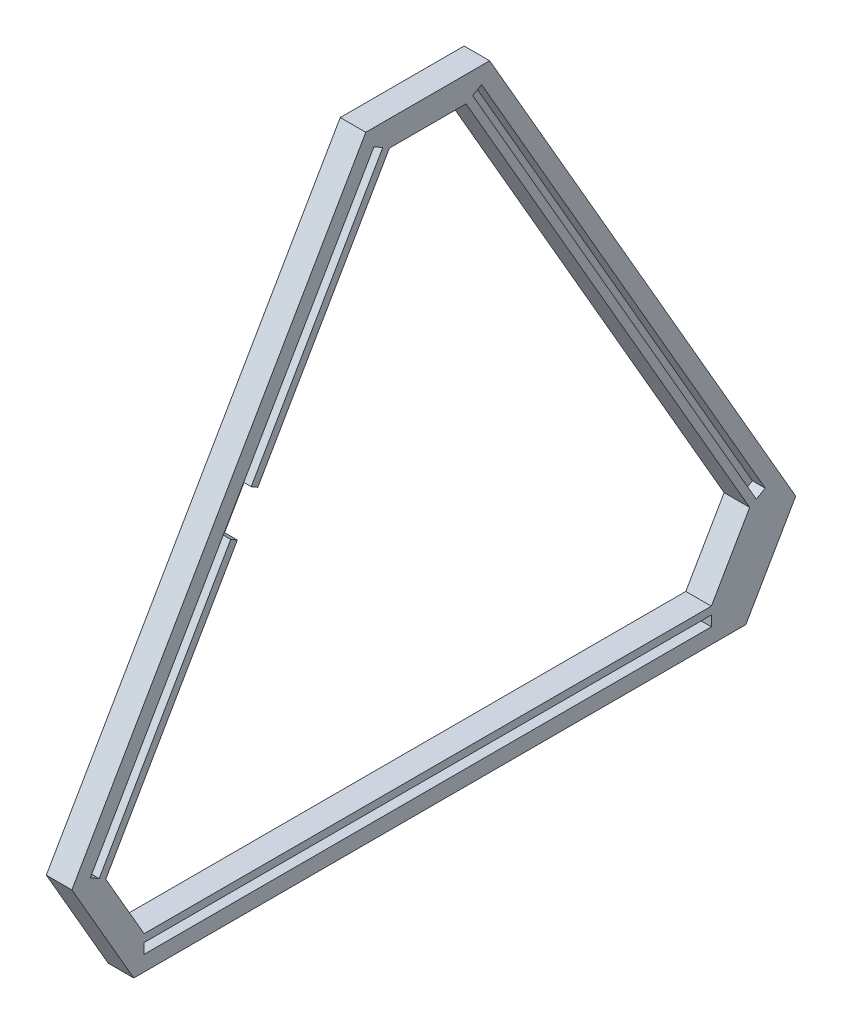
ISO-10303-21;
HEADER;
FILE_DESCRIPTION(('STEP AP214'),'2;1');
FILE_NAME('part.step','',(''),(''),'','','');
FILE_SCHEMA(('AUTOMOTIVE_DESIGN { 1 0 10303 214 1 1 1 1 }'));
ENDSEC;
DATA;
#1=APPLICATION_CONTEXT('core data for automotive mechanical design processes');
#2=APPLICATION_PROTOCOL_DEFINITION('international standard','automotive_design',2000,#1);
#3=PRODUCT_CONTEXT('',#1,'mechanical');
#4=PRODUCT('Part','Part','',(#3));
#5=PRODUCT_RELATED_PRODUCT_CATEGORY('part','',(#4));
#6=PRODUCT_DEFINITION_FORMATION('','',#4);
#7=PRODUCT_DEFINITION_CONTEXT('part definition',#1,'design');
#8=PRODUCT_DEFINITION('design','',#6,#7);
#9=PRODUCT_DEFINITION_SHAPE('','',#8);
#10=(LENGTH_UNIT() NAMED_UNIT(*) SI_UNIT(.MILLI.,.METRE.));
#11=(NAMED_UNIT(*) PLANE_ANGLE_UNIT() SI_UNIT($,.RADIAN.));
#12=(NAMED_UNIT(*) SI_UNIT($,.STERADIAN.) SOLID_ANGLE_UNIT());
#13=UNCERTAINTY_MEASURE_WITH_UNIT(LENGTH_MEASURE(1.E-05),#10,'distance_accuracy_value','');
#14=(GEOMETRIC_REPRESENTATION_CONTEXT(3) GLOBAL_UNCERTAINTY_ASSIGNED_CONTEXT((#13)) GLOBAL_UNIT_ASSIGNED_CONTEXT((#10,
#11,#12)) REPRESENTATION_CONTEXT('',''));
#15=CARTESIAN_POINT('',(0.,0.,0.));
#16=DIRECTION('',(0.,0.,1.));
#17=DIRECTION('',(1.,0.,0.));
#18=AXIS2_PLACEMENT_3D('',#15,#16,#17);
#19=CARTESIAN_POINT('',(157.5,13.7403810567666,-6.20096189432337));
#20=DIRECTION('',(0.,-0.5,-0.866025403784439));
#21=DIRECTION('',(0.,0.866025403784439,-0.5));
#22=AXIS2_PLACEMENT_3D('',#19,#20,#21);
#23=PLANE('',#22);
#24=DIRECTION('',(0.,0.866025403784439,-0.5));
#25=VECTOR('',#24,1.);
#26=CARTESIAN_POINT('',(157.5,13.7403810567666,-6.20096189432337));
#27=LINE('',#26,#25);
#28=CARTESIAN_POINT('',(157.5,65.2688925819407,-35.9509618943233));
#29=VERTEX_POINT('',#28);
#30=CARTESIAN_POINT('',(157.5,109.869200876839,-61.7009618943233));
#31=VERTEX_POINT('',#30);
#32=EDGE_CURVE('E244',#29,#31,#27,.T.);
#33=ORIENTED_EDGE('',*,*,#32,.F.);
#34=DIRECTION('',(1.,0.,0.));
#35=VECTOR('',#34,1.);
#36=CARTESIAN_POINT('',(157.5,65.2688925819407,-35.9509618943234));
#37=LINE('',#36,#35);
#38=CARTESIAN_POINT('',(160.,65.2688925819407,-35.9509618943234));
#39=VERTEX_POINT('',#38);
#40=EDGE_CURVE('E237',#29,#39,#37,.T.);
#41=ORIENTED_EDGE('',*,*,#40,.T.);
#42=DIRECTION('',(0.,0.866025403784439,-0.5));
#43=VECTOR('',#42,1.);
#44=CARTESIAN_POINT('',(160.,13.7403810567666,-6.20096189432337));
#45=LINE('',#44,#43);
#46=CARTESIAN_POINT('',(160.,109.869200876839,-61.7009618943233));
#47=VERTEX_POINT('',#46);
#48=EDGE_CURVE('E256',#39,#47,#45,.T.);
#49=ORIENTED_EDGE('',*,*,#48,.T.);
#50=DIRECTION('',(1.,0.,0.));
#51=VECTOR('',#50,1.);
#52=CARTESIAN_POINT('',(157.5,109.869200876839,-61.7009618943233));
#53=LINE('',#52,#51);
#54=EDGE_CURVE('E270',#31,#47,#53,.T.);
#55=ORIENTED_EDGE('',*,*,#54,.F.);
#56=EDGE_LOOP('',(#33,#41,#49,#55));
#57=FACE_BOUND('',#56,.T.);
#58=ADVANCED_FACE('F33',(#57),#23,.F.);
#59=CARTESIAN_POINT('',(160.,10.3947095812217,-142.504165124599));
#60=DIRECTION('',(0.,-0.5,0.866025403784438));
#61=DIRECTION('',(0.,-0.866025403784438,-0.5));
#62=AXIS2_PLACEMENT_3D('',#59,#60,#61);
#63=PLANE('',#62);
#64=DIRECTION('',(0.,0.866025403784438,0.5));
#65=VECTOR('',#64,1.);
#66=CARTESIAN_POINT('',(155.,10.3947095812217,-142.504165124599));
#67=LINE('',#66,#65);
#68=CARTESIAN_POINT('',(155.,10.3947095812217,-142.504165124599));
#69=VERTEX_POINT('',#68);
#70=CARTESIAN_POINT('',(155.,114.119200876839,-82.618802153517));
#71=VERTEX_POINT('',#70);
#72=EDGE_CURVE('E312',#69,#71,#67,.T.);
#73=ORIENTED_EDGE('',*,*,#72,.T.);
#74=DIRECTION('',(-1.,0.,0.));
#75=VECTOR('',#74,1.);
#76=CARTESIAN_POINT('',(160.,114.119200876839,-82.618802153517));
#77=LINE('',#76,#75);
#78=CARTESIAN_POINT('',(160.,114.119200876839,-82.618802153517));
#79=VERTEX_POINT('',#78);
#80=EDGE_CURVE('E11',#79,#71,#77,.T.);
#81=ORIENTED_EDGE('',*,*,#80,.F.);
#82=DIRECTION('',(0.,0.866025403784438,0.5));
#83=VECTOR('',#82,1.);
#84=CARTESIAN_POINT('',(160.,10.3947095812217,-142.504165124599));
#85=LINE('',#84,#83);
#86=CARTESIAN_POINT('',(160.,10.3947095812217,-142.504165124599));
#87=VERTEX_POINT('',#86);
#88=EDGE_CURVE('E324',#87,#79,#85,.T.);
#89=ORIENTED_EDGE('',*,*,#88,.F.);
#90=DIRECTION('',(-1.,0.,0.));
#91=VECTOR('',#90,1.);
#92=CARTESIAN_POINT('',(160.,10.3947095812217,-142.504165124599));
#93=LINE('',#92,#91);
#94=EDGE_CURVE('E338',#87,#69,#93,.T.);
#95=ORIENTED_EDGE('',*,*,#94,.T.);
#96=EDGE_LOOP('',(#73,#81,#89,#95));
#97=FACE_BOUND('',#96,.T.);
#98=ADVANCED_FACE('F35',(#97),#63,.F.);
#99=CARTESIAN_POINT('',(160.,114.119200876839,-82.618802153517));
#100=DIRECTION('',(0.,-1.,0.));
#101=DIRECTION('',(0.,0.,-1.));
#102=AXIS2_PLACEMENT_3D('',#99,#100,#101);
#103=PLANE('',#102);
#104=DIRECTION('',(0.,0.,1.));
#105=VECTOR('',#104,1.);
#106=CARTESIAN_POINT('',(155.,114.119200876839,-82.618802153517));
#107=LINE('',#106,#105);
#108=CARTESIAN_POINT('',(155.,114.119200876839,-58.381197846483));
#109=VERTEX_POINT('',#108);
#110=EDGE_CURVE('E341',#71,#109,#107,.T.);
#111=ORIENTED_EDGE('',*,*,#110,.T.);
#112=DIRECTION('',(-1.,0.,0.));
#113=VECTOR('',#112,1.);
#114=CARTESIAN_POINT('',(160.,114.119200876839,-58.381197846483));
#115=LINE('',#114,#113);
#116=CARTESIAN_POINT('',(160.,114.119200876839,-58.381197846483));
#117=VERTEX_POINT('',#116);
#118=EDGE_CURVE('E41',#117,#109,#115,.T.);
#119=ORIENTED_EDGE('',*,*,#118,.F.);
#120=DIRECTION('',(0.,0.,1.));
#121=VECTOR('',#120,1.);
#122=CARTESIAN_POINT('',(160.,114.119200876839,-82.618802153517));
#123=LINE('',#122,#121);
#124=EDGE_CURVE('E327',#79,#117,#123,.T.);
#125=ORIENTED_EDGE('',*,*,#124,.F.);
#126=ORIENTED_EDGE('',*,*,#80,.T.);
#127=EDGE_LOOP('',(#111,#119,#125,#126));
#128=FACE_BOUND('',#127,.T.);
#129=ADVANCED_FACE('F388',(#128),#103,.F.);
#130=CARTESIAN_POINT('',(160.,114.119200876839,-58.381197846483));
#131=DIRECTION('',(0.,-0.5,-0.866025403784439));
#132=DIRECTION('',(0.,0.866025403784439,-0.5));
#133=AXIS2_PLACEMENT_3D('',#130,#131,#132);
#134=PLANE('',#133);
#135=DIRECTION('',(0.,-0.866025403784439,0.5));
#136=VECTOR('',#135,1.);
#137=CARTESIAN_POINT('',(155.,114.119200876839,-58.381197846483));
#138=LINE('',#137,#136);
#139=CARTESIAN_POINT('',(155.,14.4903810567665,-0.86047190431933));
#140=VERTEX_POINT('',#139);
#141=EDGE_CURVE('E343',#109,#140,#138,.T.);
#142=ORIENTED_EDGE('',*,*,#141,.T.);
#143=DIRECTION('',(-1.,0.,0.));
#144=VECTOR('',#143,1.);
#145=CARTESIAN_POINT('',(160.,14.4903810567665,-0.86047190431933));
#146=LINE('',#145,#144);
#147=CARTESIAN_POINT('',(160.,14.4903810567665,-0.86047190431933));
#148=VERTEX_POINT('',#147);
#149=EDGE_CURVE('E358',#148,#140,#146,.T.);
#150=ORIENTED_EDGE('',*,*,#149,.F.);
#151=DIRECTION('',(0.,-0.866025403784439,0.5));
#152=VECTOR('',#151,1.);
#153=CARTESIAN_POINT('',(160.,114.119200876839,-58.381197846483));
#154=LINE('',#153,#152);
#155=EDGE_CURVE('E330',#117,#148,#154,.T.);
#156=ORIENTED_EDGE('',*,*,#155,.F.);
#157=ORIENTED_EDGE('',*,*,#118,.T.);
#158=EDGE_LOOP('',(#142,#150,#156,#157));
#159=FACE_BOUND('',#158,.T.);
#160=ADVANCED_FACE('F365',(#159),#134,.F.);
#161=CARTESIAN_POINT('',(160.,14.4903810567665,-0.86047190431933));
#162=DIRECTION('',(0.,0.5,-0.866025403784439));
#163=DIRECTION('',(0.,0.866025403784439,0.5));
#164=AXIS2_PLACEMENT_3D('',#161,#162,#163);
#165=PLANE('',#164);
#166=DIRECTION('',(0.,-0.866025403784438,-0.5));
#167=VECTOR('',#166,1.);
#168=CARTESIAN_POINT('',(155.,14.4903810567665,-0.86047190431933));
#169=LINE('',#168,#167);
#170=CARTESIAN_POINT('',(155.,-6.5,-12.9792740578363));
#171=VERTEX_POINT('',#170);
#172=EDGE_CURVE('E345',#140,#171,#169,.T.);
#173=ORIENTED_EDGE('',*,*,#172,.T.);
#174=DIRECTION('',(-1.,0.,0.));
#175=VECTOR('',#174,1.);
#176=CARTESIAN_POINT('',(160.,-6.5,-12.9792740578363));
#177=LINE('',#176,#175);
#178=CARTESIAN_POINT('',(160.,-6.5,-12.9792740578363));
#179=VERTEX_POINT('',#178);
#180=EDGE_CURVE('E355',#179,#171,#177,.T.);
#181=ORIENTED_EDGE('',*,*,#180,.F.);
#182=DIRECTION('',(0.,-0.866025403784438,-0.5));
#183=VECTOR('',#182,1.);
#184=CARTESIAN_POINT('',(160.,14.4903810567665,-0.86047190431933));
#185=LINE('',#184,#183);
#186=EDGE_CURVE('E332',#148,#179,#185,.T.);
#187=ORIENTED_EDGE('',*,*,#186,.F.);
#188=ORIENTED_EDGE('',*,*,#149,.T.);
#189=EDGE_LOOP('',(#173,#181,#187,#188));
#190=FACE_BOUND('',#189,.T.);
#191=ADVANCED_FACE('F376',(#190),#165,.F.);
#192=CARTESIAN_POINT('',(160.,-6.5,-12.9792740578363));
#193=DIRECTION('',(0.,1.,0.));
#194=DIRECTION('',(0.,0.,1.));
#195=AXIS2_PLACEMENT_3D('',#192,#193,#194);
#196=PLANE('',#195);
#197=DIRECTION('',(0.,0.,-1.));
#198=VECTOR('',#197,1.);
#199=CARTESIAN_POINT('',(155.,-6.5,-12.9792740578363));
#200=LINE('',#199,#198);
#201=CARTESIAN_POINT('',(155.,-6.5,-132.75));
#202=VERTEX_POINT('',#201);
#203=EDGE_CURVE('E347',#171,#202,#200,.T.);
#204=ORIENTED_EDGE('',*,*,#203,.T.);
#205=DIRECTION('',(-1.,0.,0.));
#206=VECTOR('',#205,1.);
#207=CARTESIAN_POINT('',(160.,-6.5,-132.75));
#208=LINE('',#207,#206);
#209=CARTESIAN_POINT('',(160.,-6.5,-132.75));
#210=VERTEX_POINT('',#209);
#211=EDGE_CURVE('E352',#210,#202,#208,.T.);
#212=ORIENTED_EDGE('',*,*,#211,.F.);
#213=DIRECTION('',(0.,0.,-1.));
#214=VECTOR('',#213,1.);
#215=CARTESIAN_POINT('',(160.,-6.5,-12.9792740578363));
#216=LINE('',#215,#214);
#217=EDGE_CURVE('E334',#179,#210,#216,.T.);
#218=ORIENTED_EDGE('',*,*,#217,.F.);
#219=ORIENTED_EDGE('',*,*,#180,.T.);
#220=EDGE_LOOP('',(#204,#212,#218,#219));
#221=FACE_BOUND('',#220,.T.);
#222=ADVANCED_FACE('F380',(#221),#196,.F.);
#223=CARTESIAN_POINT('',(160.,-6.5,-132.75));
#224=DIRECTION('',(0.,0.5,0.866025403784439));
#225=DIRECTION('',(0.,-0.866025403784439,0.5));
#226=AXIS2_PLACEMENT_3D('',#223,#224,#225);
#227=PLANE('',#226);
#228=DIRECTION('',(0.,0.866025403784439,-0.5));
#229=VECTOR('',#228,1.);
#230=CARTESIAN_POINT('',(155.,-6.5,-132.75));
#231=LINE('',#230,#229);
#232=EDGE_CURVE('E328',#202,#69,#231,.T.);
#233=ORIENTED_EDGE('',*,*,#232,.T.);
#234=ORIENTED_EDGE('',*,*,#94,.F.);
#235=DIRECTION('',(0.,0.866025403784439,-0.5));
#236=VECTOR('',#235,1.);
#237=CARTESIAN_POINT('',(160.,-6.5,-132.75));
#238=LINE('',#237,#236);
#239=EDGE_CURVE('E336',#210,#87,#238,.T.);
#240=ORIENTED_EDGE('',*,*,#239,.F.);
#241=ORIENTED_EDGE('',*,*,#211,.T.);
#242=EDGE_LOOP('',(#233,#234,#240,#241));
#243=FACE_BOUND('',#242,.T.);
#244=ADVANCED_FACE('F391',(#243),#227,.F.);
#245=CARTESIAN_POINT('',(160.,114.119200876839,-82.618802153517));
#246=DIRECTION('',(1.,0.,0.));
#247=DIRECTION('',(0.,0.,-1.));
#248=AXIS2_PLACEMENT_3D('',#245,#246,#247);
#249=PLANE('',#248);
#250=DIRECTION('',(0.,0.499999999999999,0.866025403784439));
#251=VECTOR('',#250,1.);
#252=CARTESIAN_POINT('',(160.,64.5188925819407,-37.25));
#253=LINE('',#252,#251);
#254=CARTESIAN_POINT('',(160.,64.5188925819407,-37.25));
#255=VERTEX_POINT('',#254);
#256=EDGE_CURVE('E648',#255,#39,#253,.T.);
#257=ORIENTED_EDGE('',*,*,#256,.F.);
#258=DIRECTION('',(0.,-0.866025403784439,0.5));
#259=VECTOR('',#258,1.);
#260=CARTESIAN_POINT('',(160.,109.119200876839,-63.));
#261=LINE('',#260,#259);
#262=CARTESIAN_POINT('',(160.,109.119200876839,-63.));
#263=VERTEX_POINT('',#262);
#264=EDGE_CURVE('E299',#263,#255,#261,.T.);
#265=ORIENTED_EDGE('',*,*,#264,.F.);
#266=DIRECTION('',(0.,0.,1.));
#267=VECTOR('',#266,1.);
#268=CARTESIAN_POINT('',(160.,109.119200876839,-78.));
#269=LINE('',#268,#267);
#270=CARTESIAN_POINT('',(160.,109.119200876839,-78.));
#271=VERTEX_POINT('',#270);
#272=EDGE_CURVE('E295',#271,#263,#269,.T.);
#273=ORIENTED_EDGE('',*,*,#272,.F.);
#274=DIRECTION('',(0.,0.866025403784439,0.5));
#275=VECTOR('',#274,1.);
#276=CARTESIAN_POINT('',(160.,12.9903810567666,-133.5));
#277=LINE('',#276,#275);
#278=CARTESIAN_POINT('',(160.,12.9903810567666,-133.5));
#279=VERTEX_POINT('',#278);
#280=EDGE_CURVE('E267',#279,#271,#277,.T.);
#281=ORIENTED_EDGE('',*,*,#280,.F.);
#282=DIRECTION('',(0.,0.866025403784438,-0.500000000000001));
#283=VECTOR('',#282,1.);
#284=CARTESIAN_POINT('',(160.,0.,-126.));
#285=LINE('',#284,#283);
#286=CARTESIAN_POINT('',(160.,0.,-126.));
#287=VERTEX_POINT('',#286);
#288=EDGE_CURVE('E278',#287,#279,#285,.T.);
#289=ORIENTED_EDGE('',*,*,#288,.F.);
#290=DIRECTION('',(0.,0.,-1.));
#291=VECTOR('',#290,1.);
#292=CARTESIAN_POINT('',(160.,0.,-15.));
#293=LINE('',#292,#291);
#294=CARTESIAN_POINT('',(160.,0.,-15.));
#295=VERTEX_POINT('',#294);
#296=EDGE_CURVE('E305',#295,#287,#293,.T.);
#297=ORIENTED_EDGE('',*,*,#296,.F.);
#298=DIRECTION('',(0.,-0.866025403784439,-0.5));
#299=VECTOR('',#298,1.);
#300=CARTESIAN_POINT('',(160.,12.9903810567666,-7.49999999999999));
#301=LINE('',#300,#299);
#302=CARTESIAN_POINT('',(160.,12.9903810567666,-7.49999999999999));
#303=VERTEX_POINT('',#302);
#304=EDGE_CURVE('E302',#303,#295,#301,.T.);
#305=ORIENTED_EDGE('',*,*,#304,.F.);
#306=CARTESIAN_POINT('',(160.,57.5906893516652,-33.25));
#307=VERTEX_POINT('',#306);
#308=EDGE_CURVE('E298',#307,#303,#261,.T.);
#309=ORIENTED_EDGE('',*,*,#308,.F.);
#310=DIRECTION('',(0.,-0.499999999999999,-0.866025403784439));
#311=VECTOR('',#310,1.);
#312=CARTESIAN_POINT('',(160.,57.5906893516652,-33.25));
#313=LINE('',#312,#311);
#314=CARTESIAN_POINT('',(160.,58.3406893516651,-31.9509618943234));
#315=VERTEX_POINT('',#314);
#316=EDGE_CURVE('E646',#315,#307,#313,.T.);
#317=ORIENTED_EDGE('',*,*,#316,.F.);
#318=CARTESIAN_POINT('',(160.,13.7403810567666,-6.20096189432338));
#319=VERTEX_POINT('',#318);
#320=EDGE_CURVE('E236',#319,#315,#45,.T.);
#321=ORIENTED_EDGE('',*,*,#320,.F.);
#322=DIRECTION('',(0.,-0.499999999999999,-0.866025403784439));
#323=VECTOR('',#322,1.);
#324=CARTESIAN_POINT('',(160.,14.7403810567665,-4.46891108675453));
#325=LINE('',#324,#323);
#326=CARTESIAN_POINT('',(160.,14.7403810567665,-4.46891108675453));
#327=VERTEX_POINT('',#326);
#328=EDGE_CURVE('E254',#327,#319,#325,.T.);
#329=ORIENTED_EDGE('',*,*,#328,.F.);
#330=DIRECTION('',(0.,-0.866025403784439,0.499999999999999));
#331=VECTOR('',#330,1.);
#332=CARTESIAN_POINT('',(160.,110.869200876839,-59.9689110867545));
#333=LINE('',#332,#331);
#334=CARTESIAN_POINT('',(160.,110.869200876839,-59.9689110867545));
#335=VERTEX_POINT('',#334);
#336=EDGE_CURVE('E262',#335,#327,#333,.T.);
#337=ORIENTED_EDGE('',*,*,#336,.F.);
#338=DIRECTION('',(0.,0.499999999999998,0.866025403784439));
#339=VECTOR('',#338,1.);
#340=CARTESIAN_POINT('',(160.,109.869200876839,-61.7009618943233));
#341=LINE('',#340,#339);
#342=EDGE_CURVE('E259',#47,#335,#341,.T.);
#343=ORIENTED_EDGE('',*,*,#342,.F.);
#344=ORIENTED_EDGE('',*,*,#48,.F.);
#345=EDGE_LOOP('',(#257,#265,#273,#281,#289,#297,#305,#309,#317,#321,#329,#337,#343,#344));
#346=FACE_BOUND('',#345,.T.);
#347=DIRECTION('',(0.,-0.500000000000011,0.866025403784432));
#348=VECTOR('',#347,1.);
#349=CARTESIAN_POINT('',(160.,110.869200876839,-81.0310889132455));
#350=LINE('',#349,#348);
#351=CARTESIAN_POINT('',(160.,110.869200876839,-81.0310889132455));
#352=VERTEX_POINT('',#351);
#353=CARTESIAN_POINT('',(160.,109.869200876839,-79.2990381056767));
#354=VERTEX_POINT('',#353);
#355=EDGE_CURVE('E56',#352,#354,#350,.T.);
#356=ORIENTED_EDGE('',*,*,#355,.F.);
#357=DIRECTION('',(0.,0.866025403784439,0.5));
#358=VECTOR('',#357,1.);
#359=CARTESIAN_POINT('',(160.,14.7403810567665,-136.531088913245));
#360=LINE('',#359,#358);
#361=CARTESIAN_POINT('',(160.,14.7403810567665,-136.531088913245));
#362=VERTEX_POINT('',#361);
#363=EDGE_CURVE('E663',#362,#352,#360,.T.);
#364=ORIENTED_EDGE('',*,*,#363,.F.);
#365=DIRECTION('',(0.,0.499999999999997,-0.86602540378444));
#366=VECTOR('',#365,1.);
#367=CARTESIAN_POINT('',(160.,13.7403810567666,-134.799038105677));
#368=LINE('',#367,#366);
#369=CARTESIAN_POINT('',(160.,13.7403810567666,-134.799038105677));
#370=VERTEX_POINT('',#369);
#371=EDGE_CURVE('E677',#370,#362,#368,.T.);
#372=ORIENTED_EDGE('',*,*,#371,.F.);
#373=DIRECTION('',(0.,-0.866025403784439,-0.499999999999999));
#374=VECTOR('',#373,1.);
#375=CARTESIAN_POINT('',(160.,109.869200876839,-79.2990381056767));
#376=LINE('',#375,#374);
#377=EDGE_CURVE('E674',#354,#370,#376,.T.);
#378=ORIENTED_EDGE('',*,*,#377,.F.);
#379=EDGE_LOOP('',(#356,#364,#372,#378));
#380=FACE_BOUND('',#379,.T.);
#381=DIRECTION('',(0.,-1.,0.));
#382=VECTOR('',#381,1.);
#383=CARTESIAN_POINT('',(160.,-1.5,-15.));
#384=LINE('',#383,#382);
#385=CARTESIAN_POINT('',(160.,-1.5,-15.));
#386=VERTEX_POINT('',#385);
#387=CARTESIAN_POINT('',(160.,-3.49999999999995,-15.));
#388=VERTEX_POINT('',#387);
#389=EDGE_CURVE('E684',#386,#388,#384,.T.);
#390=ORIENTED_EDGE('',*,*,#389,.F.);
#391=DIRECTION('',(0.,0.,1.));
#392=VECTOR('',#391,1.);
#393=CARTESIAN_POINT('',(160.,-1.5,-15.));
#394=LINE('',#393,#392);
#395=CARTESIAN_POINT('',(160.,-1.5,-126.));
#396=VERTEX_POINT('',#395);
#397=EDGE_CURVE('E694',#396,#386,#394,.T.);
#398=ORIENTED_EDGE('',*,*,#397,.F.);
#399=DIRECTION('',(0.,1.,0.));
#400=VECTOR('',#399,1.);
#401=CARTESIAN_POINT('',(160.,-1.5,-126.));
#402=LINE('',#401,#400);
#403=CARTESIAN_POINT('',(160.,-3.49999999999995,-126.));
#404=VERTEX_POINT('',#403);
#405=EDGE_CURVE('E708',#404,#396,#402,.T.);
#406=ORIENTED_EDGE('',*,*,#405,.F.);
#407=DIRECTION('',(0.,0.,-1.));
#408=VECTOR('',#407,1.);
#409=CARTESIAN_POINT('',(160.,-3.49999999999995,-15.));
#410=LINE('',#409,#408);
#411=EDGE_CURVE('E705',#388,#404,#410,.T.);
#412=ORIENTED_EDGE('',*,*,#411,.F.);
#413=EDGE_LOOP('',(#390,#398,#406,#412));
#414=FACE_BOUND('',#413,.T.);
#415=ORIENTED_EDGE('',*,*,#88,.T.);
#416=ORIENTED_EDGE('',*,*,#124,.T.);
#417=ORIENTED_EDGE('',*,*,#155,.T.);
#418=ORIENTED_EDGE('',*,*,#186,.T.);
#419=ORIENTED_EDGE('',*,*,#217,.T.);
#420=ORIENTED_EDGE('',*,*,#239,.T.);
#421=EDGE_LOOP('',(#415,#416,#417,#418,#419,#420));
#422=FACE_BOUND('',#421,.T.);
#423=ADVANCED_FACE('F384',(#346,#380,#414,#422),#249,.T.);
#424=CARTESIAN_POINT('',(155.,114.119200876839,-82.618802153517));
#425=DIRECTION('',(1.,0.,0.));
#426=DIRECTION('',(0.,0.,-1.));
#427=AXIS2_PLACEMENT_3D('',#424,#425,#426);
#428=PLANE('',#427);
#429=DIRECTION('',(0.,0.866025403784438,-0.500000000000001));
#430=VECTOR('',#429,1.);
#431=CARTESIAN_POINT('',(155.,0.,-126.));
#432=LINE('',#431,#430);
#433=CARTESIAN_POINT('',(155.,0.,-126.));
#434=VERTEX_POINT('',#433);
#435=CARTESIAN_POINT('',(155.,12.9903810567666,-133.5));
#436=VERTEX_POINT('',#435);
#437=EDGE_CURVE('E290',#434,#436,#432,.T.);
#438=ORIENTED_EDGE('',*,*,#437,.T.);
#439=DIRECTION('',(0.,0.866025403784439,0.5));
#440=VECTOR('',#439,1.);
#441=CARTESIAN_POINT('',(155.,12.9903810567666,-133.5));
#442=LINE('',#441,#440);
#443=CARTESIAN_POINT('',(155.,109.119200876839,-78.));
#444=VERTEX_POINT('',#443);
#445=EDGE_CURVE('E274',#436,#444,#442,.T.);
#446=ORIENTED_EDGE('',*,*,#445,.T.);
#447=DIRECTION('',(0.,0.,1.));
#448=VECTOR('',#447,1.);
#449=CARTESIAN_POINT('',(155.,109.119200876839,-78.));
#450=LINE('',#449,#448);
#451=CARTESIAN_POINT('',(155.,109.119200876839,-63.));
#452=VERTEX_POINT('',#451);
#453=EDGE_CURVE('E277',#444,#452,#450,.T.);
#454=ORIENTED_EDGE('',*,*,#453,.T.);
#455=DIRECTION('',(0.,-0.866025403784439,0.5));
#456=VECTOR('',#455,1.);
#457=CARTESIAN_POINT('',(155.,109.119200876839,-63.));
#458=LINE('',#457,#456);
#459=CARTESIAN_POINT('',(155.,12.9903810567666,-7.49999999999999));
#460=VERTEX_POINT('',#459);
#461=EDGE_CURVE('E281',#452,#460,#458,.T.);
#462=ORIENTED_EDGE('',*,*,#461,.T.);
#463=DIRECTION('',(0.,-0.866025403784439,-0.5));
#464=VECTOR('',#463,1.);
#465=CARTESIAN_POINT('',(155.,12.9903810567666,-7.49999999999999));
#466=LINE('',#465,#464);
#467=CARTESIAN_POINT('',(155.,0.,-15.));
#468=VERTEX_POINT('',#467);
#469=EDGE_CURVE('E284',#460,#468,#466,.T.);
#470=ORIENTED_EDGE('',*,*,#469,.T.);
#471=DIRECTION('',(0.,0.,-1.));
#472=VECTOR('',#471,1.);
#473=CARTESIAN_POINT('',(155.,0.,-15.));
#474=LINE('',#473,#472);
#475=EDGE_CURVE('E287',#468,#434,#474,.T.);
#476=ORIENTED_EDGE('',*,*,#475,.T.);
#477=EDGE_LOOP('',(#438,#446,#454,#462,#470,#476));
#478=FACE_BOUND('',#477,.T.);
#479=ORIENTED_EDGE('',*,*,#72,.F.);
#480=ORIENTED_EDGE('',*,*,#232,.F.);
#481=ORIENTED_EDGE('',*,*,#203,.F.);
#482=ORIENTED_EDGE('',*,*,#172,.F.);
#483=ORIENTED_EDGE('',*,*,#141,.F.);
#484=ORIENTED_EDGE('',*,*,#110,.F.);
#485=EDGE_LOOP('',(#479,#480,#481,#482,#483,#484));
#486=FACE_BOUND('',#485,.T.);
#487=ADVANCED_FACE('F371',(#478,#486),#428,.F.);
#488=CARTESIAN_POINT('',(155.,12.9903810567666,-133.5));
#489=DIRECTION('',(0.,0.5,-0.866025403784439));
#490=DIRECTION('',(0.,0.866025403784439,0.5));
#491=AXIS2_PLACEMENT_3D('',#488,#489,#490);
#492=PLANE('',#491);
#493=ORIENTED_EDGE('',*,*,#280,.T.);
#494=DIRECTION('',(1.,0.,0.));
#495=VECTOR('',#494,1.);
#496=CARTESIAN_POINT('',(155.,109.119200876839,-78.));
#497=LINE('',#496,#495);
#498=EDGE_CURVE('E293',#444,#271,#497,.T.);
#499=ORIENTED_EDGE('',*,*,#498,.F.);
#500=ORIENTED_EDGE('',*,*,#445,.F.);
#501=DIRECTION('',(1.,0.,0.));
#502=VECTOR('',#501,1.);
#503=CARTESIAN_POINT('',(155.,12.9903810567666,-133.5));
#504=LINE('',#503,#502);
#505=EDGE_CURVE('E310',#436,#279,#504,.T.);
#506=ORIENTED_EDGE('',*,*,#505,.T.);
#507=EDGE_LOOP('',(#493,#499,#500,#506));
#508=FACE_BOUND('',#507,.T.);
#509=ADVANCED_FACE('F585',(#508),#492,.F.);
#510=CARTESIAN_POINT('',(155.,0.,-126.));
#511=DIRECTION('',(0.,-0.500000000000001,-0.866025403784438));
#512=DIRECTION('',(0.,0.866025403784438,-0.500000000000001));
#513=AXIS2_PLACEMENT_3D('',#510,#511,#512);
#514=PLANE('',#513);
#515=ORIENTED_EDGE('',*,*,#288,.T.);
#516=ORIENTED_EDGE('',*,*,#505,.F.);
#517=ORIENTED_EDGE('',*,*,#437,.F.);
#518=DIRECTION('',(1.,0.,0.));
#519=VECTOR('',#518,1.);
#520=CARTESIAN_POINT('',(155.,0.,-126.));
#521=LINE('',#520,#519);
#522=EDGE_CURVE('E313',#434,#287,#521,.T.);
#523=ORIENTED_EDGE('',*,*,#522,.T.);
#524=EDGE_LOOP('',(#515,#516,#517,#523));
#525=FACE_BOUND('',#524,.T.);
#526=ADVANCED_FACE('F591',(#525),#514,.F.);
#527=CARTESIAN_POINT('',(155.,0.,-15.));
#528=DIRECTION('',(0.,-1.,0.));
#529=DIRECTION('',(0.,0.,-1.));
#530=AXIS2_PLACEMENT_3D('',#527,#528,#529);
#531=PLANE('',#530);
#532=ORIENTED_EDGE('',*,*,#296,.T.);
#533=ORIENTED_EDGE('',*,*,#522,.F.);
#534=ORIENTED_EDGE('',*,*,#475,.F.);
#535=DIRECTION('',(1.,0.,0.));
#536=VECTOR('',#535,1.);
#537=CARTESIAN_POINT('',(155.,0.,-15.));
#538=LINE('',#537,#536);
#539=EDGE_CURVE('E315',#468,#295,#538,.T.);
#540=ORIENTED_EDGE('',*,*,#539,.T.);
#541=EDGE_LOOP('',(#532,#533,#534,#540));
#542=FACE_BOUND('',#541,.T.);
#543=ADVANCED_FACE('F599',(#542),#531,.F.);
#544=CARTESIAN_POINT('',(155.,12.9903810567666,-7.49999999999999));
#545=DIRECTION('',(0.,-0.5,0.866025403784439));
#546=DIRECTION('',(0.,-0.866025403784439,-0.5));
#547=AXIS2_PLACEMENT_3D('',#544,#545,#546);
#548=PLANE('',#547);
#549=ORIENTED_EDGE('',*,*,#304,.T.);
#550=ORIENTED_EDGE('',*,*,#539,.F.);
#551=ORIENTED_EDGE('',*,*,#469,.F.);
#552=DIRECTION('',(1.,0.,0.));
#553=VECTOR('',#552,1.);
#554=CARTESIAN_POINT('',(155.,12.9903810567666,-7.49999999999999));
#555=LINE('',#554,#553);
#556=EDGE_CURVE('E317',#460,#303,#555,.T.);
#557=ORIENTED_EDGE('',*,*,#556,.T.);
#558=EDGE_LOOP('',(#549,#550,#551,#557));
#559=FACE_BOUND('',#558,.T.);
#560=ADVANCED_FACE('F539',(#559),#548,.F.);
#561=CARTESIAN_POINT('',(155.,109.119200876839,-63.));
#562=DIRECTION('',(0.,0.5,0.866025403784439));
#563=DIRECTION('',(0.,-0.866025403784439,0.5));
#564=AXIS2_PLACEMENT_3D('',#561,#562,#563);
#565=PLANE('',#564);
#566=ORIENTED_EDGE('',*,*,#264,.T.);
#567=DIRECTION('',(1.,0.,0.));
#568=VECTOR('',#567,1.);
#569=CARTESIAN_POINT('',(157.5,64.5188925819407,-37.25));
#570=LINE('',#569,#568);
#571=CARTESIAN_POINT('',(157.5,64.5188925819407,-37.25));
#572=VERTEX_POINT('',#571);
#573=EDGE_CURVE('E654',#572,#255,#570,.T.);
#574=ORIENTED_EDGE('',*,*,#573,.F.);
#575=DIRECTION('',(0.,0.866025403784439,-0.499999999999999));
#576=VECTOR('',#575,1.);
#577=CARTESIAN_POINT('',(157.5,64.5188925819407,-37.25));
#578=LINE('',#577,#576);
#579=CARTESIAN_POINT('',(157.5,57.5906893516652,-33.25));
#580=VERTEX_POINT('',#579);
#581=EDGE_CURVE('E226',#580,#572,#578,.T.);
#582=ORIENTED_EDGE('',*,*,#581,.F.);
#583=DIRECTION('',(1.,0.,0.));
#584=VECTOR('',#583,1.);
#585=CARTESIAN_POINT('',(157.5,57.5906893516652,-33.25));
#586=LINE('',#585,#584);
#587=EDGE_CURVE('E223',#580,#307,#586,.T.);
#588=ORIENTED_EDGE('',*,*,#587,.T.);
#589=ORIENTED_EDGE('',*,*,#308,.T.);
#590=ORIENTED_EDGE('',*,*,#556,.F.);
#591=ORIENTED_EDGE('',*,*,#461,.F.);
#592=DIRECTION('',(1.,0.,0.));
#593=VECTOR('',#592,1.);
#594=CARTESIAN_POINT('',(155.,109.119200876839,-63.));
#595=LINE('',#594,#593);
#596=EDGE_CURVE('E320',#452,#263,#595,.T.);
#597=ORIENTED_EDGE('',*,*,#596,.T.);
#598=EDGE_LOOP('',(#566,#574,#582,#588,#589,#590,#591,#597));
#599=FACE_BOUND('',#598,.T.);
#600=ADVANCED_FACE('F533',(#599),#565,.F.);
#601=CARTESIAN_POINT('',(155.,109.119200876839,-78.));
#602=DIRECTION('',(0.,1.,0.));
#603=DIRECTION('',(0.,0.,1.));
#604=AXIS2_PLACEMENT_3D('',#601,#602,#603);
#605=PLANE('',#604);
#606=ORIENTED_EDGE('',*,*,#272,.T.);
#607=ORIENTED_EDGE('',*,*,#596,.F.);
#608=ORIENTED_EDGE('',*,*,#453,.F.);
#609=ORIENTED_EDGE('',*,*,#498,.T.);
#610=EDGE_LOOP('',(#606,#607,#608,#609));
#611=FACE_BOUND('',#610,.T.);
#612=ADVANCED_FACE('F538',(#611),#605,.F.);
#613=CARTESIAN_POINT('',(157.5,14.7403810567665,-4.46891108675453));
#614=DIRECTION('',(0.,-0.866025403784439,0.499999999999999));
#615=DIRECTION('',(0.,-0.499999999999999,-0.866025403784439));
#616=AXIS2_PLACEMENT_3D('',#613,#614,#615);
#617=PLANE('',#616);
#618=ORIENTED_EDGE('',*,*,#328,.T.);
#619=DIRECTION('',(1.,0.,0.));
#620=VECTOR('',#619,1.);
#621=CARTESIAN_POINT('',(157.5,13.7403810567666,-6.20096189432337));
#622=LINE('',#621,#620);
#623=CARTESIAN_POINT('',(157.5,13.7403810567666,-6.20096189432337));
#624=VERTEX_POINT('',#623);
#625=EDGE_CURVE('E253',#624,#319,#622,.T.);
#626=ORIENTED_EDGE('',*,*,#625,.F.);
#627=DIRECTION('',(0.,-0.499999999999999,-0.866025403784439));
#628=VECTOR('',#627,1.);
#629=CARTESIAN_POINT('',(157.5,14.7403810567665,-4.46891108675453));
#630=LINE('',#629,#628);
#631=CARTESIAN_POINT('',(157.5,14.7403810567665,-4.46891108675453));
#632=VERTEX_POINT('',#631);
#633=EDGE_CURVE('E242',#632,#624,#630,.T.);
#634=ORIENTED_EDGE('',*,*,#633,.F.);
#635=DIRECTION('',(1.,0.,0.));
#636=VECTOR('',#635,1.);
#637=CARTESIAN_POINT('',(157.5,14.7403810567665,-4.46891108675453));
#638=LINE('',#637,#636);
#639=EDGE_CURVE('E265',#632,#327,#638,.T.);
#640=ORIENTED_EDGE('',*,*,#639,.T.);
#641=EDGE_LOOP('',(#618,#626,#634,#640));
#642=FACE_BOUND('',#641,.T.);
#643=ADVANCED_FACE('F424',(#642),#617,.F.);
#644=CARTESIAN_POINT('',(157.5,110.869200876839,-59.9689110867545));
#645=DIRECTION('',(0.,0.499999999999999,0.866025403784439));
#646=DIRECTION('',(0.,-0.866025403784439,0.499999999999999));
#647=AXIS2_PLACEMENT_3D('',#644,#645,#646);
#648=PLANE('',#647);
#649=ORIENTED_EDGE('',*,*,#336,.T.);
#650=ORIENTED_EDGE('',*,*,#639,.F.);
#651=DIRECTION('',(0.,-0.866025403784439,0.499999999999999));
#652=VECTOR('',#651,1.);
#653=CARTESIAN_POINT('',(157.5,110.869200876839,-59.9689110867545));
#654=LINE('',#653,#652);
#655=CARTESIAN_POINT('',(157.5,110.869200876839,-59.9689110867545));
#656=VERTEX_POINT('',#655);
#657=EDGE_CURVE('E247',#656,#632,#654,.T.);
#658=ORIENTED_EDGE('',*,*,#657,.F.);
#659=DIRECTION('',(1.,0.,0.));
#660=VECTOR('',#659,1.);
#661=CARTESIAN_POINT('',(157.5,110.869200876839,-59.9689110867545));
#662=LINE('',#661,#660);
#663=EDGE_CURVE('E268',#656,#335,#662,.T.);
#664=ORIENTED_EDGE('',*,*,#663,.T.);
#665=EDGE_LOOP('',(#649,#650,#658,#664));
#666=FACE_BOUND('',#665,.T.);
#667=ADVANCED_FACE('F419',(#666),#648,.F.);
#668=CARTESIAN_POINT('',(157.5,109.869200876839,-61.7009618943233));
#669=DIRECTION('',(0.,0.866025403784439,-0.499999999999999));
#670=DIRECTION('',(0.,0.499999999999999,0.866025403784439));
#671=AXIS2_PLACEMENT_3D('',#668,#669,#670);
#672=PLANE('',#671);
#673=ORIENTED_EDGE('',*,*,#342,.T.);
#674=ORIENTED_EDGE('',*,*,#663,.F.);
#675=DIRECTION('',(0.,0.499999999999998,0.866025403784439));
#676=VECTOR('',#675,1.);
#677=CARTESIAN_POINT('',(157.5,109.869200876839,-61.7009618943233));
#678=LINE('',#677,#676);
#679=EDGE_CURVE('E243',#31,#656,#678,.T.);
#680=ORIENTED_EDGE('',*,*,#679,.F.);
#681=ORIENTED_EDGE('',*,*,#54,.T.);
#682=EDGE_LOOP('',(#673,#674,#680,#681));
#683=FACE_BOUND('',#682,.T.);
#684=ADVANCED_FACE('F412',(#683),#672,.F.);
#685=ORIENTED_EDGE('',*,*,#320,.T.);
#686=DIRECTION('',(1.,0.,0.));
#687=VECTOR('',#686,1.);
#688=CARTESIAN_POINT('',(157.5,58.3406893516651,-31.9509618943234));
#689=LINE('',#688,#687);
#690=CARTESIAN_POINT('',(157.5,58.3406893516651,-31.9509618943234));
#691=VERTEX_POINT('',#690);
#692=EDGE_CURVE('E220',#691,#315,#689,.T.);
#693=ORIENTED_EDGE('',*,*,#692,.F.);
#694=EDGE_CURVE('E233',#624,#691,#27,.T.);
#695=ORIENTED_EDGE('',*,*,#694,.F.);
#696=ORIENTED_EDGE('',*,*,#625,.T.);
#697=EDGE_LOOP('',(#685,#693,#695,#696));
#698=FACE_BOUND('',#697,.T.);
#699=ADVANCED_FACE('F231',(#698),#23,.F.);
#700=CARTESIAN_POINT('',(157.5,13.7403810567666,-6.20096189432337));
#701=DIRECTION('',(1.,0.,0.));
#702=DIRECTION('',(0.,0.,-1.));
#703=AXIS2_PLACEMENT_3D('',#700,#701,#702);
#704=PLANE('',#703);
#705=ORIENTED_EDGE('',*,*,#633,.T.);
#706=ORIENTED_EDGE('',*,*,#694,.T.);
#707=DIRECTION('',(0.,-0.499999999999999,-0.866025403784439));
#708=VECTOR('',#707,1.);
#709=CARTESIAN_POINT('',(157.5,57.5906893516652,-33.25));
#710=LINE('',#709,#708);
#711=EDGE_CURVE('E217',#691,#580,#710,.T.);
#712=ORIENTED_EDGE('',*,*,#711,.T.);
#713=ORIENTED_EDGE('',*,*,#581,.T.);
#714=DIRECTION('',(0.,0.499999999999999,0.866025403784439));
#715=VECTOR('',#714,1.);
#716=CARTESIAN_POINT('',(157.5,64.5188925819407,-37.25));
#717=LINE('',#716,#715);
#718=EDGE_CURVE('E48',#572,#29,#717,.T.);
#719=ORIENTED_EDGE('',*,*,#718,.T.);
#720=ORIENTED_EDGE('',*,*,#32,.T.);
#721=ORIENTED_EDGE('',*,*,#679,.T.);
#722=ORIENTED_EDGE('',*,*,#657,.T.);
#723=EDGE_LOOP('',(#705,#706,#712,#713,#719,#720,#721,#722));
#724=FACE_BOUND('',#723,.T.);
#725=ADVANCED_FACE('F239',(#724),#704,.T.);
#726=CARTESIAN_POINT('',(157.5,-1.5,-15.));
#727=DIRECTION('',(0.,0.,1.));
#728=DIRECTION('',(1.,0.,0.));
#729=AXIS2_PLACEMENT_3D('',#726,#727,#728);
#730=PLANE('',#729);
#731=ORIENTED_EDGE('',*,*,#389,.T.);
#732=DIRECTION('',(1.,0.,0.));
#733=VECTOR('',#732,1.);
#734=CARTESIAN_POINT('',(157.5,-3.49999999999995,-15.));
#735=LINE('',#734,#733);
#736=CARTESIAN_POINT('',(157.5,-3.49999999999995,-15.));
#737=VERTEX_POINT('',#736);
#738=EDGE_CURVE('E703',#737,#388,#735,.T.);
#739=ORIENTED_EDGE('',*,*,#738,.F.);
#740=DIRECTION('',(0.,-1.,0.));
#741=VECTOR('',#740,1.);
#742=CARTESIAN_POINT('',(157.5,-1.5,-15.));
#743=LINE('',#742,#741);
#744=CARTESIAN_POINT('',(157.5,-1.5,-15.));
#745=VERTEX_POINT('',#744);
#746=EDGE_CURVE('E690',#745,#737,#743,.T.);
#747=ORIENTED_EDGE('',*,*,#746,.F.);
#748=DIRECTION('',(1.,0.,0.));
#749=VECTOR('',#748,1.);
#750=CARTESIAN_POINT('',(157.5,-1.5,-15.));
#751=LINE('',#750,#749);
#752=EDGE_CURVE('E257',#745,#386,#751,.T.);
#753=ORIENTED_EDGE('',*,*,#752,.T.);
#754=EDGE_LOOP('',(#731,#739,#747,#753));
#755=FACE_BOUND('',#754,.T.);
#756=ADVANCED_FACE('F417',(#755),#730,.F.);
#757=CARTESIAN_POINT('',(157.5,-1.5,-15.));
#758=DIRECTION('',(0.,1.,0.));
#759=DIRECTION('',(0.,0.,1.));
#760=AXIS2_PLACEMENT_3D('',#757,#758,#759);
#761=PLANE('',#760);
#762=ORIENTED_EDGE('',*,*,#397,.T.);
#763=ORIENTED_EDGE('',*,*,#752,.F.);
#764=DIRECTION('',(0.,0.,1.));
#765=VECTOR('',#764,1.);
#766=CARTESIAN_POINT('',(157.5,-1.5,-15.));
#767=LINE('',#766,#765);
#768=CARTESIAN_POINT('',(157.5,-1.5,-126.));
#769=VERTEX_POINT('',#768);
#770=EDGE_CURVE('E700',#769,#745,#767,.T.);
#771=ORIENTED_EDGE('',*,*,#770,.F.);
#772=DIRECTION('',(1.,0.,0.));
#773=VECTOR('',#772,1.);
#774=CARTESIAN_POINT('',(157.5,-1.5,-126.));
#775=LINE('',#774,#773);
#776=EDGE_CURVE('E714',#769,#396,#775,.T.);
#777=ORIENTED_EDGE('',*,*,#776,.T.);
#778=EDGE_LOOP('',(#762,#763,#771,#777));
#779=FACE_BOUND('',#778,.T.);
#780=ADVANCED_FACE('F430',(#779),#761,.F.);
#781=CARTESIAN_POINT('',(157.5,-1.5,-126.));
#782=DIRECTION('',(0.,0.,-1.));
#783=DIRECTION('',(-1.,0.,0.));
#784=AXIS2_PLACEMENT_3D('',#781,#782,#783);
#785=PLANE('',#784);
#786=ORIENTED_EDGE('',*,*,#405,.T.);
#787=ORIENTED_EDGE('',*,*,#776,.F.);
#788=DIRECTION('',(0.,1.,0.));
#789=VECTOR('',#788,1.);
#790=CARTESIAN_POINT('',(157.5,-1.5,-126.));
#791=LINE('',#790,#789);
#792=CARTESIAN_POINT('',(157.5,-3.49999999999995,-126.));
#793=VERTEX_POINT('',#792);
#794=EDGE_CURVE('E697',#793,#769,#791,.T.);
#795=ORIENTED_EDGE('',*,*,#794,.F.);
#796=DIRECTION('',(1.,0.,0.));
#797=VECTOR('',#796,1.);
#798=CARTESIAN_POINT('',(157.5,-3.49999999999995,-126.));
#799=LINE('',#798,#797);
#800=EDGE_CURVE('E716',#793,#404,#799,.T.);
#801=ORIENTED_EDGE('',*,*,#800,.T.);
#802=EDGE_LOOP('',(#786,#787,#795,#801));
#803=FACE_BOUND('',#802,.T.);
#804=ADVANCED_FACE('F436',(#803),#785,.F.);
#805=CARTESIAN_POINT('',(157.5,-3.49999999999995,-15.));
#806=DIRECTION('',(0.,-1.,0.));
#807=DIRECTION('',(0.,0.,-1.));
#808=AXIS2_PLACEMENT_3D('',#805,#806,#807);
#809=PLANE('',#808);
#810=ORIENTED_EDGE('',*,*,#411,.T.);
#811=ORIENTED_EDGE('',*,*,#800,.F.);
#812=DIRECTION('',(0.,0.,-1.));
#813=VECTOR('',#812,1.);
#814=CARTESIAN_POINT('',(157.5,-3.49999999999995,-15.));
#815=LINE('',#814,#813);
#816=EDGE_CURVE('E693',#737,#793,#815,.T.);
#817=ORIENTED_EDGE('',*,*,#816,.F.);
#818=ORIENTED_EDGE('',*,*,#738,.T.);
#819=EDGE_LOOP('',(#810,#811,#817,#818));
#820=FACE_BOUND('',#819,.T.);
#821=ADVANCED_FACE('F432',(#820),#809,.F.);
#822=CARTESIAN_POINT('',(157.5,-3.49999999999995,-15.));
#823=DIRECTION('',(1.,0.,0.));
#824=DIRECTION('',(0.,0.,-1.));
#825=AXIS2_PLACEMENT_3D('',#822,#823,#824);
#826=PLANE('',#825);
#827=ORIENTED_EDGE('',*,*,#746,.T.);
#828=ORIENTED_EDGE('',*,*,#816,.T.);
#829=ORIENTED_EDGE('',*,*,#794,.T.);
#830=ORIENTED_EDGE('',*,*,#770,.T.);
#831=EDGE_LOOP('',(#827,#828,#829,#830));
#832=FACE_BOUND('',#831,.T.);
#833=ADVANCED_FACE('F435',(#832),#826,.T.);
#834=CARTESIAN_POINT('',(157.5,110.869200876839,-81.0310889132455));
#835=DIRECTION('',(0.,0.866025403784433,0.500000000000011));
#836=DIRECTION('',(0.,-0.500000000000011,0.866025403784433));
#837=AXIS2_PLACEMENT_3D('',#834,#835,#836);
#838=PLANE('',#837);
#839=ORIENTED_EDGE('',*,*,#355,.T.);
#840=DIRECTION('',(1.,0.,0.));
#841=VECTOR('',#840,1.);
#842=CARTESIAN_POINT('',(157.5,109.869200876839,-79.2990381056767));
#843=LINE('',#842,#841);
#844=CARTESIAN_POINT('',(157.5,109.869200876839,-79.2990381056767));
#845=VERTEX_POINT('',#844);
#846=EDGE_CURVE('E672',#845,#354,#843,.T.);
#847=ORIENTED_EDGE('',*,*,#846,.F.);
#848=DIRECTION('',(0.,-0.500000000000011,0.866025403784432));
#849=VECTOR('',#848,1.);
#850=CARTESIAN_POINT('',(157.5,110.869200876839,-81.0310889132455));
#851=LINE('',#850,#849);
#852=CARTESIAN_POINT('',(157.5,110.869200876839,-81.0310889132455));
#853=VERTEX_POINT('',#852);
#854=EDGE_CURVE('E659',#853,#845,#851,.T.);
#855=ORIENTED_EDGE('',*,*,#854,.F.);
#856=DIRECTION('',(1.,0.,0.));
#857=VECTOR('',#856,1.);
#858=CARTESIAN_POINT('',(157.5,110.869200876839,-81.0310889132455));
#859=LINE('',#858,#857);
#860=EDGE_CURVE('E682',#853,#352,#859,.T.);
#861=ORIENTED_EDGE('',*,*,#860,.T.);
#862=EDGE_LOOP('',(#839,#847,#855,#861));
#863=FACE_BOUND('',#862,.T.);
#864=ADVANCED_FACE('F446',(#863),#838,.F.);
#865=CARTESIAN_POINT('',(157.5,14.7403810567665,-136.531088913245));
#866=DIRECTION('',(0.,0.5,-0.866025403784439));
#867=DIRECTION('',(0.,0.866025403784439,0.5));
#868=AXIS2_PLACEMENT_3D('',#865,#866,#867);
#869=PLANE('',#868);
#870=ORIENTED_EDGE('',*,*,#363,.T.);
#871=ORIENTED_EDGE('',*,*,#860,.F.);
#872=DIRECTION('',(0.,0.866025403784439,0.5));
#873=VECTOR('',#872,1.);
#874=CARTESIAN_POINT('',(157.5,14.7403810567665,-136.531088913245));
#875=LINE('',#874,#873);
#876=CARTESIAN_POINT('',(157.5,14.7403810567665,-136.531088913245));
#877=VERTEX_POINT('',#876);
#878=EDGE_CURVE('E669',#877,#853,#875,.T.);
#879=ORIENTED_EDGE('',*,*,#878,.F.);
#880=DIRECTION('',(1.,0.,0.));
#881=VECTOR('',#880,1.);
#882=CARTESIAN_POINT('',(157.5,14.7403810567665,-136.531088913245));
#883=LINE('',#882,#881);
#884=EDGE_CURVE('E685',#877,#362,#883,.T.);
#885=ORIENTED_EDGE('',*,*,#884,.T.);
#886=EDGE_LOOP('',(#870,#871,#879,#885));
#887=FACE_BOUND('',#886,.T.);
#888=ADVANCED_FACE('F450',(#887),#869,.F.);
#889=CARTESIAN_POINT('',(157.5,13.7403810567666,-134.799038105677));
#890=DIRECTION('',(0.,-0.86602540378444,-0.499999999999997));
#891=DIRECTION('',(0.,0.499999999999997,-0.86602540378444));
#892=AXIS2_PLACEMENT_3D('',#889,#890,#891);
#893=PLANE('',#892);
#894=ORIENTED_EDGE('',*,*,#371,.T.);
#895=ORIENTED_EDGE('',*,*,#884,.F.);
#896=DIRECTION('',(0.,0.499999999999997,-0.86602540378444));
#897=VECTOR('',#896,1.);
#898=CARTESIAN_POINT('',(157.5,13.7403810567666,-134.799038105677));
#899=LINE('',#898,#897);
#900=CARTESIAN_POINT('',(157.5,13.7403810567666,-134.799038105677));
#901=VERTEX_POINT('',#900);
#902=EDGE_CURVE('E666',#901,#877,#899,.T.);
#903=ORIENTED_EDGE('',*,*,#902,.F.);
#904=DIRECTION('',(1.,0.,0.));
#905=VECTOR('',#904,1.);
#906=CARTESIAN_POINT('',(157.5,13.7403810567666,-134.799038105677));
#907=LINE('',#906,#905);
#908=EDGE_CURVE('E687',#901,#370,#907,.T.);
#909=ORIENTED_EDGE('',*,*,#908,.T.);
#910=EDGE_LOOP('',(#894,#895,#903,#909));
#911=FACE_BOUND('',#910,.T.);
#912=ADVANCED_FACE('F455',(#911),#893,.F.);
#913=CARTESIAN_POINT('',(157.5,109.869200876839,-79.2990381056767));
#914=DIRECTION('',(0.,-0.499999999999999,0.866025403784439));
#915=DIRECTION('',(0.,-0.866025403784439,-0.499999999999999));
#916=AXIS2_PLACEMENT_3D('',#913,#914,#915);
#917=PLANE('',#916);
#918=ORIENTED_EDGE('',*,*,#377,.T.);
#919=ORIENTED_EDGE('',*,*,#908,.F.);
#920=DIRECTION('',(0.,-0.866025403784439,-0.499999999999999));
#921=VECTOR('',#920,1.);
#922=CARTESIAN_POINT('',(157.5,109.869200876839,-79.2990381056767));
#923=LINE('',#922,#921);
#924=EDGE_CURVE('E662',#845,#901,#923,.T.);
#925=ORIENTED_EDGE('',*,*,#924,.F.);
#926=ORIENTED_EDGE('',*,*,#846,.T.);
#927=EDGE_LOOP('',(#918,#919,#925,#926));
#928=FACE_BOUND('',#927,.T.);
#929=ADVANCED_FACE('F451',(#928),#917,.F.);
#930=CARTESIAN_POINT('',(157.5,109.869200876839,-79.2990381056767));
#931=DIRECTION('',(1.,0.,0.));
#932=DIRECTION('',(0.,0.,-1.));
#933=AXIS2_PLACEMENT_3D('',#930,#931,#932);
#934=PLANE('',#933);
#935=ORIENTED_EDGE('',*,*,#854,.T.);
#936=ORIENTED_EDGE('',*,*,#924,.T.);
#937=ORIENTED_EDGE('',*,*,#902,.T.);
#938=ORIENTED_EDGE('',*,*,#878,.T.);
#939=EDGE_LOOP('',(#935,#936,#937,#938));
#940=FACE_BOUND('',#939,.T.);
#941=ADVANCED_FACE('F454',(#940),#934,.T.);
#942=CARTESIAN_POINT('',(157.5,64.5188925819407,-37.25));
#943=DIRECTION('',(0.,0.866025403784439,-0.499999999999999));
#944=DIRECTION('',(0.,0.499999999999999,0.86602540378444));
#945=AXIS2_PLACEMENT_3D('',#942,#943,#944);
#946=PLANE('',#945);
#947=ORIENTED_EDGE('',*,*,#256,.T.);
#948=ORIENTED_EDGE('',*,*,#40,.F.);
#949=ORIENTED_EDGE('',*,*,#718,.F.);
#950=ORIENTED_EDGE('',*,*,#573,.T.);
#951=EDGE_LOOP('',(#947,#948,#949,#950));
#952=FACE_BOUND('',#951,.T.);
#953=ADVANCED_FACE('F465',(#952),#946,.F.);
#954=CARTESIAN_POINT('',(157.5,57.5906893516652,-33.25));
#955=DIRECTION('',(0.,-0.866025403784439,0.499999999999999));
#956=DIRECTION('',(0.,-0.499999999999999,-0.86602540378444));
#957=AXIS2_PLACEMENT_3D('',#954,#955,#956);
#958=PLANE('',#957);
#959=ORIENTED_EDGE('',*,*,#316,.T.);
#960=ORIENTED_EDGE('',*,*,#587,.F.);
#961=ORIENTED_EDGE('',*,*,#711,.F.);
#962=ORIENTED_EDGE('',*,*,#692,.T.);
#963=EDGE_LOOP('',(#959,#960,#961,#962));
#964=FACE_BOUND('',#963,.T.);
#965=ADVANCED_FACE('F219',(#964),#958,.F.);
#966=CLOSED_SHELL('',(#58,#98,#129,#160,#191,#222,#244,#423,#487,#509,#526,#543,#560,#600,#612,
#643,#667,#684,#699,#725,#756,#780,#804,#821,#833,#864,#888,#912,#929,#941,#953,#965));
#967=MANIFOLD_SOLID_BREP('B2',#966);
#968=ADVANCED_BREP_SHAPE_REPRESENTATION('',(#18,#967),#14);
#969=SHAPE_DEFINITION_REPRESENTATION(#9,#968);
ENDSEC;
END-ISO-10303-21;
